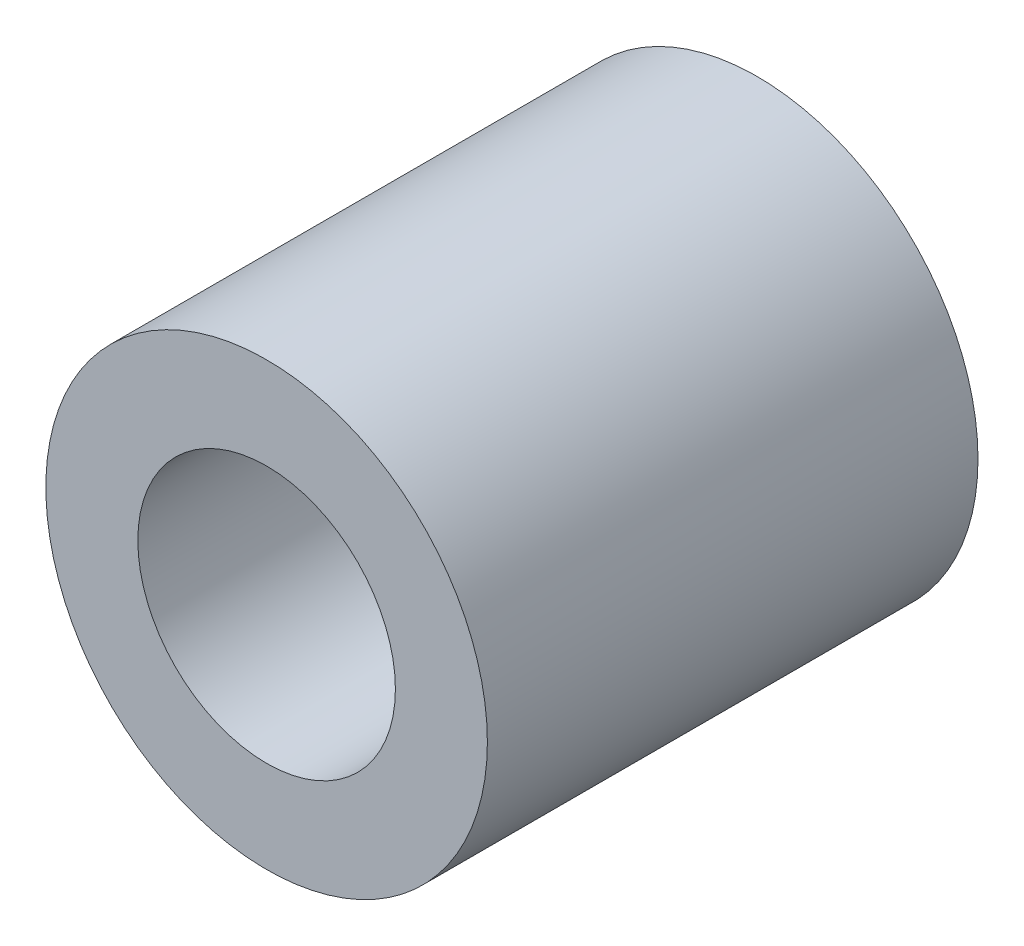
ISO-10303-21;
HEADER;
FILE_DESCRIPTION(('STEP AP214'),'2;1');
FILE_NAME('part.step','',(''),(''),'','','');
FILE_SCHEMA(('AUTOMOTIVE_DESIGN { 1 0 10303 214 1 1 1 1 }'));
ENDSEC;
DATA;
#1=APPLICATION_CONTEXT('core data for automotive mechanical design processes');
#2=APPLICATION_PROTOCOL_DEFINITION('international standard','automotive_design',2000,#1);
#3=PRODUCT_CONTEXT('',#1,'mechanical');
#4=PRODUCT('Part','Part','',(#3));
#5=PRODUCT_RELATED_PRODUCT_CATEGORY('part','',(#4));
#6=PRODUCT_DEFINITION_FORMATION('','',#4);
#7=PRODUCT_DEFINITION_CONTEXT('part definition',#1,'design');
#8=PRODUCT_DEFINITION('design','',#6,#7);
#9=PRODUCT_DEFINITION_SHAPE('','',#8);
#10=(LENGTH_UNIT() NAMED_UNIT(*) SI_UNIT(.MILLI.,.METRE.));
#11=(NAMED_UNIT(*) PLANE_ANGLE_UNIT() SI_UNIT($,.RADIAN.));
#12=(NAMED_UNIT(*) SI_UNIT($,.STERADIAN.) SOLID_ANGLE_UNIT());
#13=UNCERTAINTY_MEASURE_WITH_UNIT(LENGTH_MEASURE(1.E-05),#10,'distance_accuracy_value','');
#14=(GEOMETRIC_REPRESENTATION_CONTEXT(3) GLOBAL_UNCERTAINTY_ASSIGNED_CONTEXT((#13)) GLOBAL_UNIT_ASSIGNED_CONTEXT((#10,
#11,#12)) REPRESENTATION_CONTEXT('',''));
#15=CARTESIAN_POINT('',(0.,0.,0.));
#16=DIRECTION('',(0.,0.,1.));
#17=DIRECTION('',(1.,0.,0.));
#18=AXIS2_PLACEMENT_3D('',#15,#16,#17);
#19=CARTESIAN_POINT('',(0.,0.,20.));
#20=DIRECTION('',(0.,0.,1.));
#21=DIRECTION('',(1.,0.,0.));
#22=AXIS2_PLACEMENT_3D('',#19,#20,#21);
#23=PLANE('',#22);
#24=CARTESIAN_POINT('',(0.,0.,20.));
#25=DIRECTION('',(0.,0.,1.));
#26=DIRECTION('',(1.,0.,0.));
#27=AXIS2_PLACEMENT_3D('',#24,#25,#26);
#28=CIRCLE('',#27,9.);
#29=CARTESIAN_POINT('',(9.00000000000003,0.,20.));
#30=VERTEX_POINT('',#29);
#31=EDGE_CURVE('E10',#30,#30,#28,.T.);
#32=ORIENTED_EDGE('',*,*,#31,.T.);
#33=EDGE_LOOP('',(#32));
#34=FACE_BOUND('',#33,.T.);
#35=CARTESIAN_POINT('',(0.,0.,20.));
#36=DIRECTION('',(0.,0.,1.));
#37=DIRECTION('',(1.,0.,0.));
#38=AXIS2_PLACEMENT_3D('',#35,#36,#37);
#39=CIRCLE('',#38,5.25);
#40=CARTESIAN_POINT('',(5.25000000000002,0.,20.));
#41=VERTEX_POINT('',#40);
#42=EDGE_CURVE('E43',#41,#41,#39,.T.);
#43=ORIENTED_EDGE('',*,*,#42,.F.);
#44=EDGE_LOOP('',(#43));
#45=FACE_BOUND('',#44,.T.);
#46=ADVANCED_FACE('F32',(#34,#45),#23,.T.);
#47=CARTESIAN_POINT('',(0.,0.,0.));
#48=DIRECTION('',(0.,0.,1.));
#49=DIRECTION('',(1.,0.,0.));
#50=AXIS2_PLACEMENT_3D('',#47,#48,#49);
#51=PLANE('',#50);
#52=CARTESIAN_POINT('',(0.,0.,0.));
#53=DIRECTION('',(0.,0.,1.));
#54=DIRECTION('',(1.,0.,0.));
#55=AXIS2_PLACEMENT_3D('',#52,#53,#54);
#56=CIRCLE('',#55,9.);
#57=CARTESIAN_POINT('',(9.00000000000003,0.,0.));
#58=VERTEX_POINT('',#57);
#59=EDGE_CURVE('E39',#58,#58,#56,.T.);
#60=ORIENTED_EDGE('',*,*,#59,.F.);
#61=EDGE_LOOP('',(#60));
#62=FACE_BOUND('',#61,.T.);
#63=CARTESIAN_POINT('',(0.,0.,0.));
#64=DIRECTION('',(0.,0.,1.));
#65=DIRECTION('',(1.,0.,0.));
#66=AXIS2_PLACEMENT_3D('',#63,#64,#65);
#67=CIRCLE('',#66,5.25);
#68=CARTESIAN_POINT('',(5.25000000000002,0.,0.));
#69=VERTEX_POINT('',#68);
#70=EDGE_CURVE('E47',#69,#69,#67,.T.);
#71=ORIENTED_EDGE('',*,*,#70,.T.);
#72=EDGE_LOOP('',(#71));
#73=FACE_BOUND('',#72,.T.);
#74=ADVANCED_FACE('F53',(#62,#73),#51,.F.);
#75=CARTESIAN_POINT('',(0.,0.,20.));
#76=DIRECTION('',(0.,0.,-1.));
#77=DIRECTION('',(-1.,0.,0.));
#78=AXIS2_PLACEMENT_3D('',#75,#76,#77);
#79=CYLINDRICAL_SURFACE('',#78,9.);
#80=ORIENTED_EDGE('',*,*,#31,.F.);
#81=EDGE_LOOP('',(#80));
#82=FACE_BOUND('',#81,.T.);
#83=ORIENTED_EDGE('',*,*,#59,.T.);
#84=EDGE_LOOP('',(#83));
#85=FACE_BOUND('',#84,.T.);
#86=ADVANCED_FACE('F34',(#82,#85),#79,.T.);
#87=CARTESIAN_POINT('',(0.,0.,20.));
#88=DIRECTION('',(0.,0.,-1.));
#89=DIRECTION('',(-1.,0.,0.));
#90=AXIS2_PLACEMENT_3D('',#87,#88,#89);
#91=CYLINDRICAL_SURFACE('',#90,5.25);
#92=ORIENTED_EDGE('',*,*,#42,.T.);
#93=EDGE_LOOP('',(#92));
#94=FACE_BOUND('',#93,.T.);
#95=ORIENTED_EDGE('',*,*,#70,.F.);
#96=EDGE_LOOP('',(#95));
#97=FACE_BOUND('',#96,.T.);
#98=ADVANCED_FACE('F55',(#94,#97),#91,.F.);
#99=CLOSED_SHELL('',(#46,#74,#86,#98));
#100=MANIFOLD_SOLID_BREP('B2',#99);
#101=ADVANCED_BREP_SHAPE_REPRESENTATION('',(#18,#100),#14);
#102=SHAPE_DEFINITION_REPRESENTATION(#9,#101);
ENDSEC;
END-ISO-10303-21;
